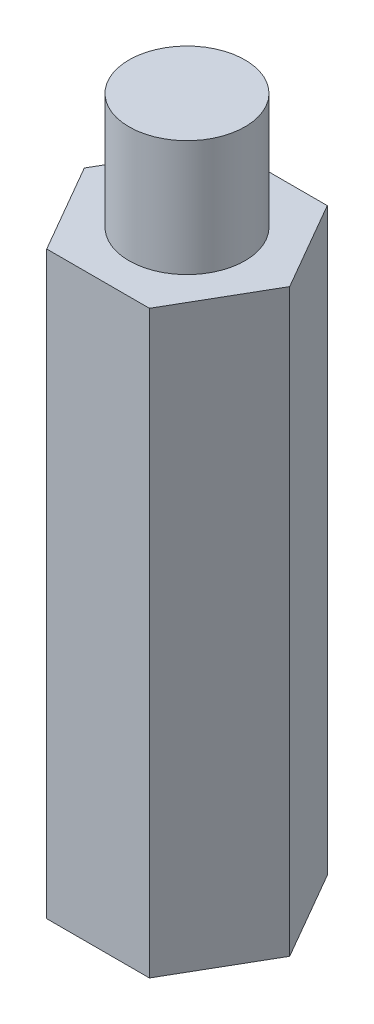
ISO-10303-21;
HEADER;
FILE_DESCRIPTION(('STEP AP214'),'2;1');
FILE_NAME('part.step','',(''),(''),'','','');
FILE_SCHEMA(('AUTOMOTIVE_DESIGN { 1 0 10303 214 1 1 1 1 }'));
ENDSEC;
DATA;
#1=APPLICATION_CONTEXT('core data for automotive mechanical design processes');
#2=APPLICATION_PROTOCOL_DEFINITION('international standard','automotive_design',2000,#1);
#3=PRODUCT_CONTEXT('',#1,'mechanical');
#4=PRODUCT('Part','Part','',(#3));
#5=PRODUCT_RELATED_PRODUCT_CATEGORY('part','',(#4));
#6=PRODUCT_DEFINITION_FORMATION('','',#4);
#7=PRODUCT_DEFINITION_CONTEXT('part definition',#1,'design');
#8=PRODUCT_DEFINITION('design','',#6,#7);
#9=PRODUCT_DEFINITION_SHAPE('','',#8);
#10=(LENGTH_UNIT() NAMED_UNIT(*) SI_UNIT(.MILLI.,.METRE.));
#11=(NAMED_UNIT(*) PLANE_ANGLE_UNIT() SI_UNIT($,.RADIAN.));
#12=(NAMED_UNIT(*) SI_UNIT($,.STERADIAN.) SOLID_ANGLE_UNIT());
#13=UNCERTAINTY_MEASURE_WITH_UNIT(LENGTH_MEASURE(1.E-05),#10,'distance_accuracy_value','');
#14=(GEOMETRIC_REPRESENTATION_CONTEXT(3) GLOBAL_UNCERTAINTY_ASSIGNED_CONTEXT((#13)) GLOBAL_UNIT_ASSIGNED_CONTEXT((#10,
#11,#12)) REPRESENTATION_CONTEXT('',''));
#15=CARTESIAN_POINT('',(0.,0.,0.));
#16=DIRECTION('',(0.,0.,1.));
#17=DIRECTION('',(1.,0.,0.));
#18=AXIS2_PLACEMENT_3D('',#15,#16,#17);
#19=CARTESIAN_POINT('',(1.32790561913614,15.,2.3));
#20=DIRECTION('',(-0.866025403784439,0.,-0.5));
#21=DIRECTION('',(-0.5,0.,0.866025403784439));
#22=AXIS2_PLACEMENT_3D('',#19,#20,#21);
#23=PLANE('',#22);
#24=DIRECTION('',(0.5,0.,-0.866025403784439));
#25=VECTOR('',#24,1.);
#26=CARTESIAN_POINT('',(1.32790561913614,0.,2.3));
#27=LINE('',#26,#25);
#28=CARTESIAN_POINT('',(1.32790561913614,0.,2.3));
#29=VERTEX_POINT('',#28);
#30=CARTESIAN_POINT('',(2.65581123827228,0.,0.));
#31=VERTEX_POINT('',#30);
#32=EDGE_CURVE('E127',#29,#31,#27,.T.);
#33=ORIENTED_EDGE('',*,*,#32,.T.);
#34=DIRECTION('',(0.,-1.,0.));
#35=VECTOR('',#34,1.);
#36=CARTESIAN_POINT('',(2.65581123827228,15.,0.));
#37=LINE('',#36,#35);
#38=CARTESIAN_POINT('',(2.65581123827228,15.,0.));
#39=VERTEX_POINT('',#38);
#40=EDGE_CURVE('E44',#39,#31,#37,.T.);
#41=ORIENTED_EDGE('',*,*,#40,.F.);
#42=DIRECTION('',(0.5,0.,-0.866025403784439));
#43=VECTOR('',#42,1.);
#44=CARTESIAN_POINT('',(1.32790561913614,15.,2.3));
#45=LINE('',#44,#43);
#46=CARTESIAN_POINT('',(1.32790561913614,15.,2.3));
#47=VERTEX_POINT('',#46);
#48=EDGE_CURVE('E138',#47,#39,#45,.T.);
#49=ORIENTED_EDGE('',*,*,#48,.F.);
#50=DIRECTION('',(0.,-1.,0.));
#51=VECTOR('',#50,1.);
#52=CARTESIAN_POINT('',(1.32790561913614,15.,2.3));
#53=LINE('',#52,#51);
#54=EDGE_CURVE('E123',#47,#29,#53,.T.);
#55=ORIENTED_EDGE('',*,*,#54,.T.);
#56=EDGE_LOOP('',(#33,#41,#49,#55));
#57=FACE_BOUND('',#56,.T.);
#58=ADVANCED_FACE('F41',(#57),#23,.F.);
#59=CARTESIAN_POINT('',(2.65581123827228,15.,0.));
#60=DIRECTION('',(-0.866025403784438,0.,0.5));
#61=DIRECTION('',(0.5,0.,0.866025403784439));
#62=AXIS2_PLACEMENT_3D('',#59,#60,#61);
#63=PLANE('',#62);
#64=DIRECTION('',(-0.5,0.,-0.866025403784438));
#65=VECTOR('',#64,1.);
#66=CARTESIAN_POINT('',(2.65581123827228,0.,0.));
#67=LINE('',#66,#65);
#68=CARTESIAN_POINT('',(1.32790561913614,0.,-2.3));
#69=VERTEX_POINT('',#68);
#70=EDGE_CURVE('E130',#31,#69,#67,.T.);
#71=ORIENTED_EDGE('',*,*,#70,.T.);
#72=DIRECTION('',(0.,-1.,0.));
#73=VECTOR('',#72,1.);
#74=CARTESIAN_POINT('',(1.32790561913614,15.,-2.3));
#75=LINE('',#74,#73);
#76=CARTESIAN_POINT('',(1.32790561913614,15.,-2.3));
#77=VERTEX_POINT('',#76);
#78=EDGE_CURVE('E141',#77,#69,#75,.T.);
#79=ORIENTED_EDGE('',*,*,#78,.F.);
#80=DIRECTION('',(-0.5,0.,-0.866025403784438));
#81=VECTOR('',#80,1.);
#82=CARTESIAN_POINT('',(2.65581123827228,15.,0.));
#83=LINE('',#82,#81);
#84=EDGE_CURVE('E96',#39,#77,#83,.T.);
#85=ORIENTED_EDGE('',*,*,#84,.F.);
#86=ORIENTED_EDGE('',*,*,#40,.T.);
#87=EDGE_LOOP('',(#71,#79,#85,#86));
#88=FACE_BOUND('',#87,.T.);
#89=ADVANCED_FACE('F146',(#88),#63,.F.);
#90=CARTESIAN_POINT('',(1.32790561913614,15.,-2.3));
#91=DIRECTION('',(0.,0.,1.));
#92=DIRECTION('',(1.,0.,0.));
#93=AXIS2_PLACEMENT_3D('',#90,#91,#92);
#94=PLANE('',#93);
#95=DIRECTION('',(-1.,0.,0.));
#96=VECTOR('',#95,1.);
#97=CARTESIAN_POINT('',(1.32790561913614,0.,-2.3));
#98=LINE('',#97,#96);
#99=CARTESIAN_POINT('',(-1.32790561913614,0.,-2.3));
#100=VERTEX_POINT('',#99);
#101=EDGE_CURVE('E133',#69,#100,#98,.T.);
#102=ORIENTED_EDGE('',*,*,#101,.T.);
#103=DIRECTION('',(0.,-1.,0.));
#104=VECTOR('',#103,1.);
#105=CARTESIAN_POINT('',(-1.32790561913614,15.,-2.3));
#106=LINE('',#105,#104);
#107=CARTESIAN_POINT('',(-1.32790561913614,15.,-2.3));
#108=VERTEX_POINT('',#107);
#109=EDGE_CURVE('E118',#108,#100,#106,.T.);
#110=ORIENTED_EDGE('',*,*,#109,.F.);
#111=DIRECTION('',(-1.,0.,0.));
#112=VECTOR('',#111,1.);
#113=CARTESIAN_POINT('',(1.32790561913614,15.,-2.3));
#114=LINE('',#113,#112);
#115=EDGE_CURVE('E109',#77,#108,#114,.T.);
#116=ORIENTED_EDGE('',*,*,#115,.F.);
#117=ORIENTED_EDGE('',*,*,#78,.T.);
#118=EDGE_LOOP('',(#102,#110,#116,#117));
#119=FACE_BOUND('',#118,.T.);
#120=ADVANCED_FACE('F152',(#119),#94,.F.);
#121=CARTESIAN_POINT('',(-1.32790561913614,15.,-2.3));
#122=DIRECTION('',(0.866025403784439,0.,0.5));
#123=DIRECTION('',(0.5,0.,-0.866025403784439));
#124=AXIS2_PLACEMENT_3D('',#121,#122,#123);
#125=PLANE('',#124);
#126=DIRECTION('',(-0.5,0.,0.866025403784439));
#127=VECTOR('',#126,1.);
#128=CARTESIAN_POINT('',(-1.32790561913614,0.,-2.3));
#129=LINE('',#128,#127);
#130=CARTESIAN_POINT('',(-2.65581123827228,0.,0.));
#131=VERTEX_POINT('',#130);
#132=EDGE_CURVE('E117',#100,#131,#129,.T.);
#133=ORIENTED_EDGE('',*,*,#132,.T.);
#134=DIRECTION('',(0.,-1.,0.));
#135=VECTOR('',#134,1.);
#136=CARTESIAN_POINT('',(-2.65581123827228,15.,0.));
#137=LINE('',#136,#135);
#138=CARTESIAN_POINT('',(-2.65581123827228,15.,0.));
#139=VERTEX_POINT('',#138);
#140=EDGE_CURVE('E114',#139,#131,#137,.T.);
#141=ORIENTED_EDGE('',*,*,#140,.F.);
#142=DIRECTION('',(-0.5,0.,0.866025403784439));
#143=VECTOR('',#142,1.);
#144=CARTESIAN_POINT('',(-1.32790561913614,15.,-2.3));
#145=LINE('',#144,#143);
#146=EDGE_CURVE('E103',#108,#139,#145,.T.);
#147=ORIENTED_EDGE('',*,*,#146,.F.);
#148=ORIENTED_EDGE('',*,*,#109,.T.);
#149=EDGE_LOOP('',(#133,#141,#147,#148));
#150=FACE_BOUND('',#149,.T.);
#151=ADVANCED_FACE('F115',(#150),#125,.F.);
#152=CARTESIAN_POINT('',(-2.65581123827228,15.,0.));
#153=DIRECTION('',(0.866025403784439,0.,-0.5));
#154=DIRECTION('',(-0.5,0.,-0.866025403784439));
#155=AXIS2_PLACEMENT_3D('',#152,#153,#154);
#156=PLANE('',#155);
#157=DIRECTION('',(0.5,0.,0.866025403784439));
#158=VECTOR('',#157,1.);
#159=CARTESIAN_POINT('',(-2.65581123827228,0.,0.));
#160=LINE('',#159,#158);
#161=CARTESIAN_POINT('',(-1.32790561913614,0.,2.3));
#162=VERTEX_POINT('',#161);
#163=EDGE_CURVE('E81',#131,#162,#160,.T.);
#164=ORIENTED_EDGE('',*,*,#163,.T.);
#165=DIRECTION('',(0.,-1.,0.));
#166=VECTOR('',#165,1.);
#167=CARTESIAN_POINT('',(-1.32790561913614,15.,2.3));
#168=LINE('',#167,#166);
#169=CARTESIAN_POINT('',(-1.32790561913614,15.,2.3));
#170=VERTEX_POINT('',#169);
#171=EDGE_CURVE('E119',#170,#162,#168,.T.);
#172=ORIENTED_EDGE('',*,*,#171,.F.);
#173=DIRECTION('',(0.5,0.,0.866025403784439));
#174=VECTOR('',#173,1.);
#175=CARTESIAN_POINT('',(-2.65581123827228,15.,0.));
#176=LINE('',#175,#174);
#177=EDGE_CURVE('E107',#139,#170,#176,.T.);
#178=ORIENTED_EDGE('',*,*,#177,.F.);
#179=ORIENTED_EDGE('',*,*,#140,.T.);
#180=EDGE_LOOP('',(#164,#172,#178,#179));
#181=FACE_BOUND('',#180,.T.);
#182=ADVANCED_FACE('F121',(#181),#156,.F.);
#183=CARTESIAN_POINT('',(-1.32790561913614,15.,2.3));
#184=DIRECTION('',(0.,0.,-1.));
#185=DIRECTION('',(-1.,0.,0.));
#186=AXIS2_PLACEMENT_3D('',#183,#184,#185);
#187=PLANE('',#186);
#188=DIRECTION('',(1.,0.,0.));
#189=VECTOR('',#188,1.);
#190=CARTESIAN_POINT('',(-1.32790561913614,0.,2.3));
#191=LINE('',#190,#189);
#192=EDGE_CURVE('E87',#162,#29,#191,.T.);
#193=ORIENTED_EDGE('',*,*,#192,.T.);
#194=ORIENTED_EDGE('',*,*,#54,.F.);
#195=DIRECTION('',(1.,0.,0.));
#196=VECTOR('',#195,1.);
#197=CARTESIAN_POINT('',(-1.32790561913614,15.,2.3));
#198=LINE('',#197,#196);
#199=EDGE_CURVE('E58',#170,#47,#198,.T.);
#200=ORIENTED_EDGE('',*,*,#199,.F.);
#201=ORIENTED_EDGE('',*,*,#171,.T.);
#202=EDGE_LOOP('',(#193,#194,#200,#201));
#203=FACE_BOUND('',#202,.T.);
#204=ADVANCED_FACE('F184',(#203),#187,.F.);
#205=CARTESIAN_POINT('',(0.,15.,0.));
#206=DIRECTION('',(0.,1.,0.));
#207=DIRECTION('',(0.,0.,1.));
#208=AXIS2_PLACEMENT_3D('',#205,#206,#207);
#209=PLANE('',#208);
#210=CARTESIAN_POINT('',(0.,15.,0.));
#211=DIRECTION('',(0.,1.,0.));
#212=DIRECTION('',(0.,0.,1.));
#213=AXIS2_PLACEMENT_3D('',#210,#211,#212);
#214=CIRCLE('',#213,1.5);
#215=CARTESIAN_POINT('',(0.,15.,1.5));
#216=VERTEX_POINT('',#215);
#217=EDGE_CURVE('E11',#216,#216,#214,.T.);
#218=ORIENTED_EDGE('',*,*,#217,.F.);
#219=EDGE_LOOP('',(#218));
#220=FACE_BOUND('',#219,.T.);
#221=ORIENTED_EDGE('',*,*,#48,.T.);
#222=ORIENTED_EDGE('',*,*,#84,.T.);
#223=ORIENTED_EDGE('',*,*,#115,.T.);
#224=ORIENTED_EDGE('',*,*,#146,.T.);
#225=ORIENTED_EDGE('',*,*,#177,.T.);
#226=ORIENTED_EDGE('',*,*,#199,.T.);
#227=EDGE_LOOP('',(#221,#222,#223,#224,#225,#226));
#228=FACE_BOUND('',#227,.T.);
#229=ADVANCED_FACE('F105',(#220,#228),#209,.T.);
#230=CARTESIAN_POINT('',(0.,0.,0.));
#231=DIRECTION('',(0.,1.,0.));
#232=DIRECTION('',(0.,0.,1.));
#233=AXIS2_PLACEMENT_3D('',#230,#231,#232);
#234=PLANE('',#233);
#235=CARTESIAN_POINT('',(0.,0.,0.));
#236=DIRECTION('',(0.,-1.,0.));
#237=DIRECTION('',(0.,0.,-1.));
#238=AXIS2_PLACEMENT_3D('',#235,#236,#237);
#239=CIRCLE('',#238,1.5);
#240=CARTESIAN_POINT('',(0.,0.,-1.5));
#241=VERTEX_POINT('',#240);
#242=EDGE_CURVE('E159',#241,#241,#239,.T.);
#243=ORIENTED_EDGE('',*,*,#242,.F.);
#244=EDGE_LOOP('',(#243));
#245=FACE_BOUND('',#244,.T.);
#246=ORIENTED_EDGE('',*,*,#32,.F.);
#247=ORIENTED_EDGE('',*,*,#192,.F.);
#248=ORIENTED_EDGE('',*,*,#163,.F.);
#249=ORIENTED_EDGE('',*,*,#132,.F.);
#250=ORIENTED_EDGE('',*,*,#101,.F.);
#251=ORIENTED_EDGE('',*,*,#70,.F.);
#252=EDGE_LOOP('',(#246,#247,#248,#249,#250,#251));
#253=FACE_BOUND('',#252,.T.);
#254=ADVANCED_FACE('F151',(#245,#253),#234,.F.);
#255=CARTESIAN_POINT('',(0.,18.,0.));
#256=DIRECTION('',(0.,-1.,0.));
#257=DIRECTION('',(0.,0.,-1.));
#258=AXIS2_PLACEMENT_3D('',#255,#256,#257);
#259=CYLINDRICAL_SURFACE('',#258,1.5);
#260=CARTESIAN_POINT('',(0.,18.,0.));
#261=DIRECTION('',(0.,1.,0.));
#262=DIRECTION('',(0.,0.,1.));
#263=AXIS2_PLACEMENT_3D('',#260,#261,#262);
#264=CIRCLE('',#263,1.5);
#265=CARTESIAN_POINT('',(0.,18.,1.5));
#266=VERTEX_POINT('',#265);
#267=EDGE_CURVE('E131',#266,#266,#264,.T.);
#268=ORIENTED_EDGE('',*,*,#267,.F.);
#269=EDGE_LOOP('',(#268));
#270=FACE_BOUND('',#269,.T.);
#271=ORIENTED_EDGE('',*,*,#217,.T.);
#272=EDGE_LOOP('',(#271));
#273=FACE_BOUND('',#272,.T.);
#274=ADVANCED_FACE('F175',(#270,#273),#259,.T.);
#275=CARTESIAN_POINT('',(0.,18.,0.));
#276=DIRECTION('',(0.,1.,0.));
#277=DIRECTION('',(0.,0.,1.));
#278=AXIS2_PLACEMENT_3D('',#275,#276,#277);
#279=PLANE('',#278);
#280=ORIENTED_EDGE('',*,*,#267,.T.);
#281=EDGE_LOOP('',(#280));
#282=FACE_BOUND('',#281,.T.);
#283=ADVANCED_FACE('F170',(#282),#279,.T.);
#284=CARTESIAN_POINT('',(0.,5.,0.));
#285=DIRECTION('',(0.,-1.,0.));
#286=DIRECTION('',(0.,0.,-1.));
#287=AXIS2_PLACEMENT_3D('',#284,#285,#286);
#288=CYLINDRICAL_SURFACE('',#287,1.5);
#289=CARTESIAN_POINT('',(0.,5.,0.));
#290=DIRECTION('',(0.,-1.,0.));
#291=DIRECTION('',(0.,0.,-1.));
#292=AXIS2_PLACEMENT_3D('',#289,#290,#291);
#293=CIRCLE('',#292,1.5);
#294=CARTESIAN_POINT('',(0.,5.,-1.5));
#295=VERTEX_POINT('',#294);
#296=EDGE_CURVE('E158',#295,#295,#293,.T.);
#297=ORIENTED_EDGE('',*,*,#296,.F.);
#298=EDGE_LOOP('',(#297));
#299=FACE_BOUND('',#298,.T.);
#300=ORIENTED_EDGE('',*,*,#242,.T.);
#301=EDGE_LOOP('',(#300));
#302=FACE_BOUND('',#301,.T.);
#303=ADVANCED_FACE('F167',(#299,#302),#288,.F.);
#304=CARTESIAN_POINT('',(0.,5.,0.));
#305=DIRECTION('',(0.,-1.,0.));
#306=DIRECTION('',(0.,0.,-1.));
#307=AXIS2_PLACEMENT_3D('',#304,#305,#306);
#308=PLANE('',#307);
#309=ORIENTED_EDGE('',*,*,#296,.T.);
#310=EDGE_LOOP('',(#309));
#311=FACE_BOUND('',#310,.T.);
#312=ADVANCED_FACE('F165',(#311),#308,.T.);
#313=CLOSED_SHELL('',(#58,#89,#120,#151,#182,#204,#229,#254,#274,#283,#303,#312));
#314=MANIFOLD_SOLID_BREP('B2',#313);
#315=ADVANCED_BREP_SHAPE_REPRESENTATION('',(#18,#314),#14);
#316=SHAPE_DEFINITION_REPRESENTATION(#9,#315);
ENDSEC;
END-ISO-10303-21;
